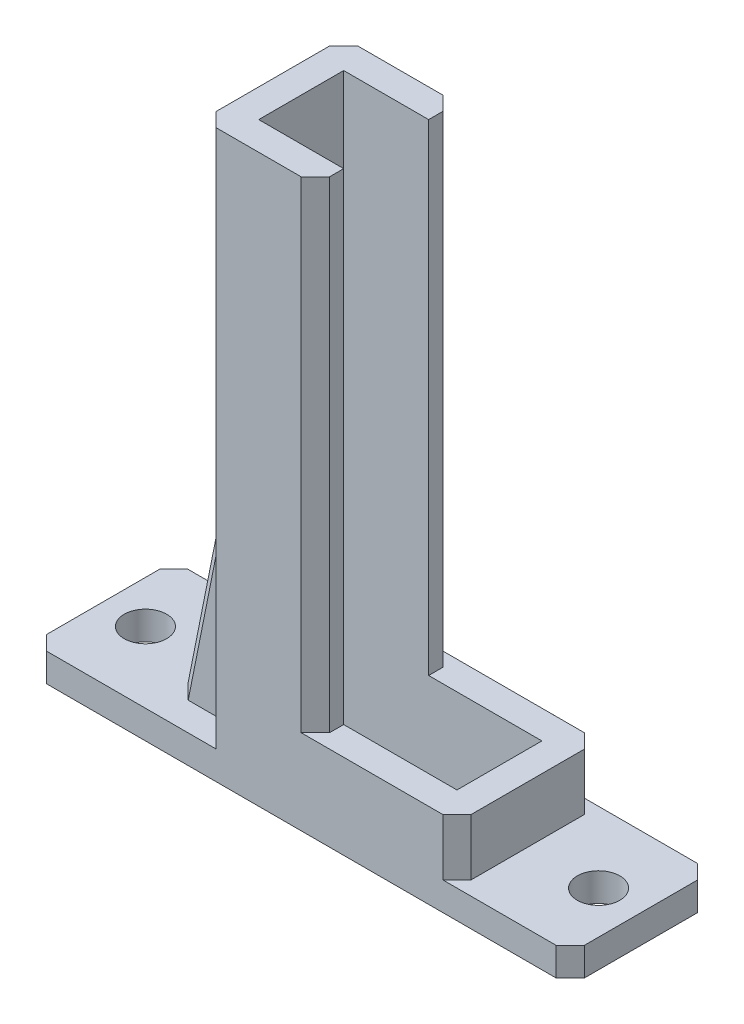
ISO-10303-21;
HEADER;
FILE_DESCRIPTION(('STEP AP214'),'2;1');
FILE_NAME('part.step','',(''),(''),'','','');
FILE_SCHEMA(('AUTOMOTIVE_DESIGN { 1 0 10303 214 1 1 1 1 }'));
ENDSEC;
DATA;
#1=APPLICATION_CONTEXT('core data for automotive mechanical design processes');
#2=APPLICATION_PROTOCOL_DEFINITION('international standard','automotive_design',2000,#1);
#3=PRODUCT_CONTEXT('',#1,'mechanical');
#4=PRODUCT('Part','Part','',(#3));
#5=PRODUCT_RELATED_PRODUCT_CATEGORY('part','',(#4));
#6=PRODUCT_DEFINITION_FORMATION('','',#4);
#7=PRODUCT_DEFINITION_CONTEXT('part definition',#1,'design');
#8=PRODUCT_DEFINITION('design','',#6,#7);
#9=PRODUCT_DEFINITION_SHAPE('','',#8);
#10=(LENGTH_UNIT() NAMED_UNIT(*) SI_UNIT(.MILLI.,.METRE.));
#11=(NAMED_UNIT(*) PLANE_ANGLE_UNIT() SI_UNIT($,.RADIAN.));
#12=(NAMED_UNIT(*) SI_UNIT($,.STERADIAN.) SOLID_ANGLE_UNIT());
#13=UNCERTAINTY_MEASURE_WITH_UNIT(LENGTH_MEASURE(1.E-05),#10,'distance_accuracy_value','');
#14=(GEOMETRIC_REPRESENTATION_CONTEXT(3) GLOBAL_UNCERTAINTY_ASSIGNED_CONTEXT((#13)) GLOBAL_UNIT_ASSIGNED_CONTEXT((#10,
#11,#12)) REPRESENTATION_CONTEXT('',''));
#15=CARTESIAN_POINT('',(0.,0.,0.));
#16=DIRECTION('',(0.,0.,1.));
#17=DIRECTION('',(1.,0.,0.));
#18=AXIS2_PLACEMENT_3D('',#15,#16,#17);
#19=CARTESIAN_POINT('',(0.,6.,0.));
#20=DIRECTION('',(1.,0.,0.));
#21=DIRECTION('',(0.,0.,-1.));
#22=AXIS2_PLACEMENT_3D('',#19,#20,#21);
#23=PLANE('',#22);
#24=DIRECTION('',(0.,0.,1.));
#25=VECTOR('',#24,1.);
#26=CARTESIAN_POINT('',(0.,40.,-10.));
#27=LINE('',#26,#25);
#28=CARTESIAN_POINT('',(0.,40.,-8.99999999999999));
#29=VERTEX_POINT('',#28);
#30=CARTESIAN_POINT('',(0.,40.,-1.00000000000001));
#31=VERTEX_POINT('',#30);
#32=EDGE_CURVE('E586',#29,#31,#27,.T.);
#33=ORIENTED_EDGE('',*,*,#32,.F.);
#34=DIRECTION('',(0.,-1.,0.));
#35=VECTOR('',#34,1.);
#36=CARTESIAN_POINT('',(0.,6.,-8.99999999999999));
#37=LINE('',#36,#35);
#38=CARTESIAN_POINT('',(0.,2.,-8.99999999999999));
#39=VERTEX_POINT('',#38);
#40=EDGE_CURVE('E469',#29,#39,#37,.T.);
#41=ORIENTED_EDGE('',*,*,#40,.T.);
#42=DIRECTION('',(0.,0.,-1.));
#43=VECTOR('',#42,1.);
#44=CARTESIAN_POINT('',(0.,2.,0.));
#45=LINE('',#44,#43);
#46=CARTESIAN_POINT('',(0.,2.,-8.));
#47=VERTEX_POINT('',#46);
#48=EDGE_CURVE('E557',#47,#39,#45,.T.);
#49=ORIENTED_EDGE('',*,*,#48,.F.);
#50=DIRECTION('',(0.,1.,0.));
#51=VECTOR('',#50,1.);
#52=CARTESIAN_POINT('',(0.,22.,-8.));
#53=LINE('',#52,#51);
#54=CARTESIAN_POINT('',(0.,16.9009804864072,-8.));
#55=VERTEX_POINT('',#54);
#56=EDGE_CURVE('E639',#47,#55,#53,.T.);
#57=ORIENTED_EDGE('',*,*,#56,.T.);
#58=DIRECTION('',(0.,-0.981306762925316,-0.192450089729874));
#59=VECTOR('',#58,1.);
#60=CARTESIAN_POINT('',(0.,7.91456061463515,-9.76238193398089));
#61=LINE('',#60,#59);
#62=CARTESIAN_POINT('',(0.,22.,-7.));
#63=VERTEX_POINT('',#62);
#64=EDGE_CURVE('E11',#55,#63,#61,.F.);
#65=ORIENTED_EDGE('',*,*,#64,.T.);
#66=DIRECTION('',(0.,0.,1.));
#67=VECTOR('',#66,1.);
#68=CARTESIAN_POINT('',(0.,22.,-8.));
#69=LINE('',#68,#67);
#70=CARTESIAN_POINT('',(0.,22.,-3.));
#71=VERTEX_POINT('',#70);
#72=EDGE_CURVE('E521',#63,#71,#69,.T.);
#73=ORIENTED_EDGE('',*,*,#72,.T.);
#74=DIRECTION('',(0.,-0.981306762925316,0.192450089729876));
#75=VECTOR('',#74,1.);
#76=CARTESIAN_POINT('',(0.,6.02603486886006,0.132752304351294));
#77=LINE('',#76,#75);
#78=CARTESIAN_POINT('',(0.,16.9009804864072,-2.));
#79=VERTEX_POINT('',#78);
#80=EDGE_CURVE('E508',#71,#79,#77,.T.);
#81=ORIENTED_EDGE('',*,*,#80,.T.);
#82=DIRECTION('',(0.,1.,0.));
#83=VECTOR('',#82,1.);
#84=CARTESIAN_POINT('',(0.,22.,-2.));
#85=LINE('',#84,#83);
#86=CARTESIAN_POINT('',(0.,2.,-2.));
#87=VERTEX_POINT('',#86);
#88=EDGE_CURVE('E518',#87,#79,#85,.T.);
#89=ORIENTED_EDGE('',*,*,#88,.F.);
#90=CARTESIAN_POINT('',(0.,2.,-1.00000000000001));
#91=VERTEX_POINT('',#90);
#92=EDGE_CURVE('E554',#91,#87,#45,.T.);
#93=ORIENTED_EDGE('',*,*,#92,.F.);
#94=DIRECTION('',(0.,1.,0.));
#95=VECTOR('',#94,1.);
#96=CARTESIAN_POINT('',(0.,6.,-1.00000000000001));
#97=LINE('',#96,#95);
#98=EDGE_CURVE('E465',#91,#31,#97,.T.);
#99=ORIENTED_EDGE('',*,*,#98,.T.);
#100=EDGE_LOOP('',(#33,#41,#49,#57,#65,#73,#81,#89,#93,#99));
#101=FACE_BOUND('',#100,.T.);
#102=ADVANCED_FACE('F50',(#101),#23,.F.);
#103=CARTESIAN_POINT('',(18.,6.,0.));
#104=DIRECTION('',(-1.,0.,0.));
#105=DIRECTION('',(0.,0.,1.));
#106=AXIS2_PLACEMENT_3D('',#103,#104,#105);
#107=PLANE('',#106);
#108=DIRECTION('',(0.,0.,1.));
#109=VECTOR('',#108,1.);
#110=CARTESIAN_POINT('',(18.,2.,0.));
#111=LINE('',#110,#109);
#112=CARTESIAN_POINT('',(18.,2.,-8.99999999999999));
#113=VERTEX_POINT('',#112);
#114=CARTESIAN_POINT('',(18.,2.,-1.00000000000001));
#115=VERTEX_POINT('',#114);
#116=EDGE_CURVE('E574',#113,#115,#111,.T.);
#117=ORIENTED_EDGE('',*,*,#116,.F.);
#118=DIRECTION('',(0.,1.,0.));
#119=VECTOR('',#118,1.);
#120=CARTESIAN_POINT('',(18.,6.,-8.99999999999999));
#121=LINE('',#120,#119);
#122=CARTESIAN_POINT('',(18.,6.,-8.99999999999999));
#123=VERTEX_POINT('',#122);
#124=EDGE_CURVE('E438',#113,#123,#121,.T.);
#125=ORIENTED_EDGE('',*,*,#124,.T.);
#126=DIRECTION('',(0.,0.,-1.));
#127=VECTOR('',#126,1.);
#128=CARTESIAN_POINT('',(18.,6.,0.));
#129=LINE('',#128,#127);
#130=CARTESIAN_POINT('',(18.,6.,-1.00000000000001));
#131=VERTEX_POINT('',#130);
#132=EDGE_CURVE('E346',#131,#123,#129,.T.);
#133=ORIENTED_EDGE('',*,*,#132,.F.);
#134=DIRECTION('',(0.,-1.,0.));
#135=VECTOR('',#134,1.);
#136=CARTESIAN_POINT('',(18.,6.,-1.00000000000001));
#137=LINE('',#136,#135);
#138=EDGE_CURVE('E434',#131,#115,#137,.T.);
#139=ORIENTED_EDGE('',*,*,#138,.T.);
#140=EDGE_LOOP('',(#117,#125,#133,#139));
#141=FACE_BOUND('',#140,.T.);
#142=ADVANCED_FACE('F685',(#141),#107,.F.);
#143=CARTESIAN_POINT('',(0.,6.,0.));
#144=DIRECTION('',(0.,-1.,0.));
#145=DIRECTION('',(0.,0.,-1.));
#146=AXIS2_PLACEMENT_3D('',#143,#144,#145);
#147=PLANE('',#146);
#148=ORIENTED_EDGE('',*,*,#132,.T.);
#149=DIRECTION('',(0.707106781186545,0.,0.70710678118655));
#150=VECTOR('',#149,1.);
#151=CARTESIAN_POINT('',(17.,6.,-10.));
#152=LINE('',#151,#150);
#153=CARTESIAN_POINT('',(17.,6.,-10.));
#154=VERTEX_POINT('',#153);
#155=EDGE_CURVE('E443',#123,#154,#152,.F.);
#156=ORIENTED_EDGE('',*,*,#155,.T.);
#157=DIRECTION('',(-1.,0.,0.));
#158=VECTOR('',#157,1.);
#159=CARTESIAN_POINT('',(0.,6.,-10.));
#160=LINE('',#159,#158);
#161=CARTESIAN_POINT('',(6.99999999999999,6.,-10.));
#162=VERTEX_POINT('',#161);
#163=EDGE_CURVE('E354',#154,#162,#160,.T.);
#164=ORIENTED_EDGE('',*,*,#163,.T.);
#165=DIRECTION('',(-0.707106781186548,0.,-0.707106781186548));
#166=VECTOR('',#165,1.);
#167=CARTESIAN_POINT('',(8.49999999999999,6.,-8.49999999999999));
#168=LINE('',#167,#166);
#169=CARTESIAN_POINT('',(8.,6.,-8.99999999999999));
#170=VERTEX_POINT('',#169);
#171=EDGE_CURVE('E479',#162,#170,#168,.F.);
#172=ORIENTED_EDGE('',*,*,#171,.T.);
#173=DIRECTION('',(0.,0.,-1.));
#174=VECTOR('',#173,1.);
#175=CARTESIAN_POINT('',(8.,6.,-8.));
#176=LINE('',#175,#174);
#177=CARTESIAN_POINT('',(8.,6.,-8.));
#178=VERTEX_POINT('',#177);
#179=EDGE_CURVE('E297',#178,#170,#176,.T.);
#180=ORIENTED_EDGE('',*,*,#179,.F.);
#181=DIRECTION('',(-1.,0.,0.));
#182=VECTOR('',#181,1.);
#183=CARTESIAN_POINT('',(2.,6.,-8.));
#184=LINE('',#183,#182);
#185=CARTESIAN_POINT('',(16.,6.,-8.));
#186=VERTEX_POINT('',#185);
#187=EDGE_CURVE('E311',#186,#178,#184,.T.);
#188=ORIENTED_EDGE('',*,*,#187,.F.);
#189=DIRECTION('',(0.,0.,-1.));
#190=VECTOR('',#189,1.);
#191=CARTESIAN_POINT('',(16.,6.,-2.));
#192=LINE('',#191,#190);
#193=CARTESIAN_POINT('',(16.,6.,-2.));
#194=VERTEX_POINT('',#193);
#195=EDGE_CURVE('E310',#194,#186,#192,.T.);
#196=ORIENTED_EDGE('',*,*,#195,.F.);
#197=DIRECTION('',(1.,0.,0.));
#198=VECTOR('',#197,1.);
#199=CARTESIAN_POINT('',(2.,6.,-2.));
#200=LINE('',#199,#198);
#201=CARTESIAN_POINT('',(8.,6.,-2.));
#202=VERTEX_POINT('',#201);
#203=EDGE_CURVE('E308',#202,#194,#200,.T.);
#204=ORIENTED_EDGE('',*,*,#203,.F.);
#205=DIRECTION('',(0.,0.,-1.));
#206=VECTOR('',#205,1.);
#207=CARTESIAN_POINT('',(8.,6.,0.));
#208=LINE('',#207,#206);
#209=CARTESIAN_POINT('',(8.,6.,-1.00000000000001));
#210=VERTEX_POINT('',#209);
#211=EDGE_CURVE('E275',#210,#202,#208,.T.);
#212=ORIENTED_EDGE('',*,*,#211,.F.);
#213=DIRECTION('',(0.707106781186548,0.,-0.707106781186548));
#214=VECTOR('',#213,1.);
#215=CARTESIAN_POINT('',(3.5,6.,3.5));
#216=LINE('',#215,#214);
#217=CARTESIAN_POINT('',(6.99999999999999,6.,0.));
#218=VERTEX_POINT('',#217);
#219=EDGE_CURVE('E485',#210,#218,#216,.F.);
#220=ORIENTED_EDGE('',*,*,#219,.T.);
#221=DIRECTION('',(1.,0.,0.));
#222=VECTOR('',#221,1.);
#223=CARTESIAN_POINT('',(0.,6.,0.));
#224=LINE('',#223,#222);
#225=CARTESIAN_POINT('',(17.,6.,0.));
#226=VERTEX_POINT('',#225);
#227=EDGE_CURVE('E343',#218,#226,#224,.T.);
#228=ORIENTED_EDGE('',*,*,#227,.T.);
#229=DIRECTION('',(-0.707106781186548,0.,0.707106781186548));
#230=VECTOR('',#229,1.);
#231=CARTESIAN_POINT('',(18.,6.,-1.00000000000001));
#232=LINE('',#231,#230);
#233=EDGE_CURVE('E445',#226,#131,#232,.F.);
#234=ORIENTED_EDGE('',*,*,#233,.T.);
#235=EDGE_LOOP('',(#148,#156,#164,#172,#180,#188,#196,#204,#212,#220,#228,#234));
#236=FACE_BOUND('',#235,.T.);
#237=ADVANCED_FACE('F599',(#236),#147,.F.);
#238=CARTESIAN_POINT('',(0.,0.,0.));
#239=DIRECTION('',(0.,-1.,0.));
#240=DIRECTION('',(0.,0.,-1.));
#241=AXIS2_PLACEMENT_3D('',#238,#239,#240);
#242=PLANE('',#241);
#243=CARTESIAN_POINT('',(-9.,0.,-5.));
#244=DIRECTION('',(0.,1.,0.));
#245=DIRECTION('',(0.,0.,1.));
#246=AXIS2_PLACEMENT_3D('',#243,#244,#245);
#247=CIRCLE('',#246,1.5);
#248=CARTESIAN_POINT('',(-9.,0.,-3.5));
#249=VERTEX_POINT('',#248);
#250=EDGE_CURVE('E533',#249,#249,#247,.T.);
#251=ORIENTED_EDGE('',*,*,#250,.T.);
#252=EDGE_LOOP('',(#251));
#253=FACE_BOUND('',#252,.T.);
#254=CARTESIAN_POINT('',(23.,0.,-5.));
#255=DIRECTION('',(0.,1.,0.));
#256=DIRECTION('',(0.,0.,1.));
#257=AXIS2_PLACEMENT_3D('',#254,#255,#256);
#258=CIRCLE('',#257,1.5);
#259=CARTESIAN_POINT('',(23.,0.,-3.5));
#260=VERTEX_POINT('',#259);
#261=EDGE_CURVE('E646',#260,#260,#258,.T.);
#262=ORIENTED_EDGE('',*,*,#261,.T.);
#263=EDGE_LOOP('',(#262));
#264=FACE_BOUND('',#263,.T.);
#265=DIRECTION('',(1.,0.,0.));
#266=VECTOR('',#265,1.);
#267=CARTESIAN_POINT('',(0.,0.,0.));
#268=LINE('',#267,#266);
#269=CARTESIAN_POINT('',(-11.,0.,0.));
#270=VERTEX_POINT('',#269);
#271=CARTESIAN_POINT('',(25.,0.,0.));
#272=VERTEX_POINT('',#271);
#273=EDGE_CURVE('E344',#270,#272,#268,.T.);
#274=ORIENTED_EDGE('',*,*,#273,.F.);
#275=DIRECTION('',(0.707106781186545,0.,0.70710678118655));
#276=VECTOR('',#275,1.);
#277=CARTESIAN_POINT('',(-5.50000000000004,0.,5.5));
#278=LINE('',#277,#276);
#279=CARTESIAN_POINT('',(-12.,0.,-1.00000000000001));
#280=VERTEX_POINT('',#279);
#281=EDGE_CURVE('E389',#270,#280,#278,.F.);
#282=ORIENTED_EDGE('',*,*,#281,.T.);
#283=DIRECTION('',(0.,0.,1.));
#284=VECTOR('',#283,1.);
#285=CARTESIAN_POINT('',(-12.,0.,0.));
#286=LINE('',#285,#284);
#287=CARTESIAN_POINT('',(-12.,0.,-8.99999999999999));
#288=VERTEX_POINT('',#287);
#289=EDGE_CURVE('E567',#288,#280,#286,.T.);
#290=ORIENTED_EDGE('',*,*,#289,.F.);
#291=DIRECTION('',(-0.707106781186548,0.,0.707106781186548));
#292=VECTOR('',#291,1.);
#293=CARTESIAN_POINT('',(-10.5,0.,-10.5));
#294=LINE('',#293,#292);
#295=CARTESIAN_POINT('',(-11.,0.,-10.));
#296=VERTEX_POINT('',#295);
#297=EDGE_CURVE('E384',#288,#296,#294,.F.);
#298=ORIENTED_EDGE('',*,*,#297,.T.);
#299=DIRECTION('',(-1.,0.,0.));
#300=VECTOR('',#299,1.);
#301=CARTESIAN_POINT('',(0.,0.,-10.));
#302=LINE('',#301,#300);
#303=CARTESIAN_POINT('',(25.,0.,-10.));
#304=VERTEX_POINT('',#303);
#305=EDGE_CURVE('E349',#304,#296,#302,.T.);
#306=ORIENTED_EDGE('',*,*,#305,.F.);
#307=DIRECTION('',(-0.707106781186545,0.,-0.70710678118655));
#308=VECTOR('',#307,1.);
#309=CARTESIAN_POINT('',(17.5000000000001,0.,-17.5));
#310=LINE('',#309,#308);
#311=CARTESIAN_POINT('',(26.,0.,-8.99999999999999));
#312=VERTEX_POINT('',#311);
#313=EDGE_CURVE('E385',#304,#312,#310,.F.);
#314=ORIENTED_EDGE('',*,*,#313,.T.);
#315=DIRECTION('',(0.,0.,-1.));
#316=VECTOR('',#315,1.);
#317=CARTESIAN_POINT('',(26.,0.,0.));
#318=LINE('',#317,#316);
#319=CARTESIAN_POINT('',(26.,0.,-1.00000000000001));
#320=VERTEX_POINT('',#319);
#321=EDGE_CURVE('E568',#320,#312,#318,.T.);
#322=ORIENTED_EDGE('',*,*,#321,.F.);
#323=DIRECTION('',(0.707106781186548,0.,-0.707106781186548));
#324=VECTOR('',#323,1.);
#325=CARTESIAN_POINT('',(12.5,0.,12.5));
#326=LINE('',#325,#324);
#327=EDGE_CURVE('E377',#320,#272,#326,.F.);
#328=ORIENTED_EDGE('',*,*,#327,.T.);
#329=EDGE_LOOP('',(#274,#282,#290,#298,#306,#314,#322,#328));
#330=FACE_BOUND('',#329,.T.);
#331=DIRECTION('',(0.,0.,1.));
#332=VECTOR('',#331,1.);
#333=CARTESIAN_POINT('',(2.,0.,-2.));
#334=LINE('',#333,#332);
#335=CARTESIAN_POINT('',(2.,0.,-8.));
#336=VERTEX_POINT('',#335);
#337=CARTESIAN_POINT('',(2.,0.,-2.));
#338=VERTEX_POINT('',#337);
#339=EDGE_CURVE('E309',#336,#338,#334,.T.);
#340=ORIENTED_EDGE('',*,*,#339,.T.);
#341=DIRECTION('',(1.,0.,0.));
#342=VECTOR('',#341,1.);
#343=CARTESIAN_POINT('',(2.,0.,-2.));
#344=LINE('',#343,#342);
#345=CARTESIAN_POINT('',(16.,0.,-2.));
#346=VERTEX_POINT('',#345);
#347=EDGE_CURVE('E277',#338,#346,#344,.T.);
#348=ORIENTED_EDGE('',*,*,#347,.T.);
#349=DIRECTION('',(0.,0.,-1.));
#350=VECTOR('',#349,1.);
#351=CARTESIAN_POINT('',(16.,0.,-2.));
#352=LINE('',#351,#350);
#353=CARTESIAN_POINT('',(16.,0.,-8.));
#354=VERTEX_POINT('',#353);
#355=EDGE_CURVE('E319',#346,#354,#352,.T.);
#356=ORIENTED_EDGE('',*,*,#355,.T.);
#357=DIRECTION('',(-1.,0.,0.));
#358=VECTOR('',#357,1.);
#359=CARTESIAN_POINT('',(2.,0.,-8.));
#360=LINE('',#359,#358);
#361=EDGE_CURVE('E322',#354,#336,#360,.T.);
#362=ORIENTED_EDGE('',*,*,#361,.T.);
#363=EDGE_LOOP('',(#340,#348,#356,#362));
#364=FACE_BOUND('',#363,.T.);
#365=ADVANCED_FACE('F606',(#253,#264,#330,#364),#242,.T.);
#366=CARTESIAN_POINT('',(0.,6.,0.));
#367=DIRECTION('',(0.,0.,-1.));
#368=DIRECTION('',(-1.,0.,0.));
#369=AXIS2_PLACEMENT_3D('',#366,#367,#368);
#370=PLANE('',#369);
#371=DIRECTION('',(1.,0.,0.));
#372=VECTOR('',#371,1.);
#373=CARTESIAN_POINT('',(0.,2.,0.));
#374=LINE('',#373,#372);
#375=CARTESIAN_POINT('',(-11.,2.,0.));
#376=VERTEX_POINT('',#375);
#377=CARTESIAN_POINT('',(1.00000000000001,2.,0.));
#378=VERTEX_POINT('',#377);
#379=EDGE_CURVE('E299',#376,#378,#374,.T.);
#380=ORIENTED_EDGE('',*,*,#379,.F.);
#381=DIRECTION('',(0.,-1.,0.));
#382=VECTOR('',#381,1.);
#383=CARTESIAN_POINT('',(-11.,6.,0.));
#384=LINE('',#383,#382);
#385=EDGE_CURVE('E374',#376,#270,#384,.T.);
#386=ORIENTED_EDGE('',*,*,#385,.T.);
#387=ORIENTED_EDGE('',*,*,#273,.T.);
#388=DIRECTION('',(0.,1.,0.));
#389=VECTOR('',#388,1.);
#390=CARTESIAN_POINT('',(25.,6.,0.));
#391=LINE('',#390,#389);
#392=CARTESIAN_POINT('',(25.,2.,0.));
#393=VERTEX_POINT('',#392);
#394=EDGE_CURVE('E375',#272,#393,#391,.T.);
#395=ORIENTED_EDGE('',*,*,#394,.T.);
#396=DIRECTION('',(1.,0.,0.));
#397=VECTOR('',#396,1.);
#398=CARTESIAN_POINT('',(18.,2.,0.));
#399=LINE('',#398,#397);
#400=CARTESIAN_POINT('',(17.,2.,0.));
#401=VERTEX_POINT('',#400);
#402=EDGE_CURVE('E579',#401,#393,#399,.T.);
#403=ORIENTED_EDGE('',*,*,#402,.F.);
#404=DIRECTION('',(0.,1.,0.));
#405=VECTOR('',#404,1.);
#406=CARTESIAN_POINT('',(17.,6.,0.));
#407=LINE('',#406,#405);
#408=EDGE_CURVE('E369',#401,#226,#407,.T.);
#409=ORIENTED_EDGE('',*,*,#408,.T.);
#410=ORIENTED_EDGE('',*,*,#227,.F.);
#411=DIRECTION('',(0.,1.,0.));
#412=VECTOR('',#411,1.);
#413=CARTESIAN_POINT('',(6.99999999999999,6.,0.));
#414=LINE('',#413,#412);
#415=CARTESIAN_POINT('',(6.99999999999999,40.,0.));
#416=VERTEX_POINT('',#415);
#417=EDGE_CURVE('E368',#218,#416,#414,.T.);
#418=ORIENTED_EDGE('',*,*,#417,.T.);
#419=DIRECTION('',(1.,0.,0.));
#420=VECTOR('',#419,1.);
#421=CARTESIAN_POINT('',(0.,40.,0.));
#422=LINE('',#421,#420);
#423=CARTESIAN_POINT('',(1.00000000000001,40.,0.));
#424=VERTEX_POINT('',#423);
#425=EDGE_CURVE('E266',#424,#416,#422,.T.);
#426=ORIENTED_EDGE('',*,*,#425,.F.);
#427=DIRECTION('',(0.,-1.,0.));
#428=VECTOR('',#427,1.);
#429=CARTESIAN_POINT('',(1.00000000000001,6.,0.));
#430=LINE('',#429,#428);
#431=EDGE_CURVE('E356',#424,#378,#430,.T.);
#432=ORIENTED_EDGE('',*,*,#431,.T.);
#433=EDGE_LOOP('',(#380,#386,#387,#395,#403,#409,#410,#418,#426,#432));
#434=FACE_BOUND('',#433,.T.);
#435=ADVANCED_FACE('F694',(#434),#370,.F.);
#436=CARTESIAN_POINT('',(0.,6.,-10.));
#437=DIRECTION('',(0.,0.,1.));
#438=DIRECTION('',(1.,0.,0.));
#439=AXIS2_PLACEMENT_3D('',#436,#437,#438);
#440=PLANE('',#439);
#441=ORIENTED_EDGE('',*,*,#305,.T.);
#442=DIRECTION('',(0.,1.,0.));
#443=VECTOR('',#442,1.);
#444=CARTESIAN_POINT('',(-11.,6.,-10.));
#445=LINE('',#444,#443);
#446=CARTESIAN_POINT('',(-11.,2.,-10.));
#447=VERTEX_POINT('',#446);
#448=EDGE_CURVE('E420',#296,#447,#445,.T.);
#449=ORIENTED_EDGE('',*,*,#448,.T.);
#450=DIRECTION('',(-1.,0.,0.));
#451=VECTOR('',#450,1.);
#452=CARTESIAN_POINT('',(0.,2.,-10.));
#453=LINE('',#452,#451);
#454=CARTESIAN_POINT('',(1.00000000000001,2.,-10.));
#455=VERTEX_POINT('',#454);
#456=EDGE_CURVE('E556',#455,#447,#453,.T.);
#457=ORIENTED_EDGE('',*,*,#456,.F.);
#458=DIRECTION('',(0.,1.,0.));
#459=VECTOR('',#458,1.);
#460=CARTESIAN_POINT('',(1.00000000000001,6.,-10.));
#461=LINE('',#460,#459);
#462=CARTESIAN_POINT('',(1.00000000000001,40.,-10.));
#463=VERTEX_POINT('',#462);
#464=EDGE_CURVE('E404',#455,#463,#461,.T.);
#465=ORIENTED_EDGE('',*,*,#464,.T.);
#466=DIRECTION('',(-1.,0.,0.));
#467=VECTOR('',#466,1.);
#468=CARTESIAN_POINT('',(8.,40.,-10.));
#469=LINE('',#468,#467);
#470=CARTESIAN_POINT('',(6.99999999999999,40.,-10.));
#471=VERTEX_POINT('',#470);
#472=EDGE_CURVE('E302',#471,#463,#469,.T.);
#473=ORIENTED_EDGE('',*,*,#472,.F.);
#474=DIRECTION('',(0.,-1.,0.));
#475=VECTOR('',#474,1.);
#476=CARTESIAN_POINT('',(6.99999999999999,6.,-10.));
#477=LINE('',#476,#475);
#478=EDGE_CURVE('E407',#471,#162,#477,.T.);
#479=ORIENTED_EDGE('',*,*,#478,.T.);
#480=ORIENTED_EDGE('',*,*,#163,.F.);
#481=DIRECTION('',(0.,-1.,0.));
#482=VECTOR('',#481,1.);
#483=CARTESIAN_POINT('',(17.,6.,-10.));
#484=LINE('',#483,#482);
#485=CARTESIAN_POINT('',(17.,2.,-10.));
#486=VERTEX_POINT('',#485);
#487=EDGE_CURVE('E411',#154,#486,#484,.T.);
#488=ORIENTED_EDGE('',*,*,#487,.T.);
#489=DIRECTION('',(-1.,0.,0.));
#490=VECTOR('',#489,1.);
#491=CARTESIAN_POINT('',(18.,2.,-10.));
#492=LINE('',#491,#490);
#493=CARTESIAN_POINT('',(25.,2.,-10.));
#494=VERTEX_POINT('',#493);
#495=EDGE_CURVE('E545',#494,#486,#492,.T.);
#496=ORIENTED_EDGE('',*,*,#495,.F.);
#497=DIRECTION('',(0.,-1.,0.));
#498=VECTOR('',#497,1.);
#499=CARTESIAN_POINT('',(25.,6.,-10.));
#500=LINE('',#499,#498);
#501=EDGE_CURVE('E415',#494,#304,#500,.T.);
#502=ORIENTED_EDGE('',*,*,#501,.T.);
#503=EDGE_LOOP('',(#441,#449,#457,#465,#473,#479,#480,#488,#496,#502));
#504=FACE_BOUND('',#503,.T.);
#505=ADVANCED_FACE('F628',(#504),#440,.F.);
#506=CARTESIAN_POINT('',(2.,6.,-2.));
#507=DIRECTION('',(0.,0.,-1.));
#508=DIRECTION('',(-1.,0.,0.));
#509=AXIS2_PLACEMENT_3D('',#506,#507,#508);
#510=PLANE('',#509);
#511=ORIENTED_EDGE('',*,*,#347,.F.);
#512=DIRECTION('',(0.,-1.,0.));
#513=VECTOR('',#512,1.);
#514=CARTESIAN_POINT('',(2.,6.,-2.));
#515=LINE('',#514,#513);
#516=CARTESIAN_POINT('',(2.,40.,-2.));
#517=VERTEX_POINT('',#516);
#518=EDGE_CURVE('E281',#517,#338,#515,.T.);
#519=ORIENTED_EDGE('',*,*,#518,.F.);
#520=DIRECTION('',(-1.,0.,0.));
#521=VECTOR('',#520,1.);
#522=CARTESIAN_POINT('',(8.,40.,-2.));
#523=LINE('',#522,#521);
#524=CARTESIAN_POINT('',(8.,40.,-2.));
#525=VERTEX_POINT('',#524);
#526=EDGE_CURVE('E260',#525,#517,#523,.T.);
#527=ORIENTED_EDGE('',*,*,#526,.F.);
#528=DIRECTION('',(0.,-1.,0.));
#529=VECTOR('',#528,1.);
#530=CARTESIAN_POINT('',(8.,40.,-2.));
#531=LINE('',#530,#529);
#532=EDGE_CURVE('E267',#525,#202,#531,.T.);
#533=ORIENTED_EDGE('',*,*,#532,.T.);
#534=ORIENTED_EDGE('',*,*,#203,.T.);
#535=DIRECTION('',(0.,-1.,0.));
#536=VECTOR('',#535,1.);
#537=CARTESIAN_POINT('',(16.,6.,-2.));
#538=LINE('',#537,#536);
#539=EDGE_CURVE('E338',#194,#346,#538,.T.);
#540=ORIENTED_EDGE('',*,*,#539,.T.);
#541=EDGE_LOOP('',(#511,#519,#527,#533,#534,#540));
#542=FACE_BOUND('',#541,.T.);
#543=ADVANCED_FACE('F276',(#542),#510,.T.);
#544=CARTESIAN_POINT('',(16.,6.,-2.));
#545=DIRECTION('',(-1.,0.,0.));
#546=DIRECTION('',(0.,0.,1.));
#547=AXIS2_PLACEMENT_3D('',#544,#545,#546);
#548=PLANE('',#547);
#549=ORIENTED_EDGE('',*,*,#355,.F.);
#550=ORIENTED_EDGE('',*,*,#539,.F.);
#551=ORIENTED_EDGE('',*,*,#195,.T.);
#552=DIRECTION('',(0.,-1.,0.));
#553=VECTOR('',#552,1.);
#554=CARTESIAN_POINT('',(16.,6.,-8.));
#555=LINE('',#554,#553);
#556=EDGE_CURVE('E336',#186,#354,#555,.T.);
#557=ORIENTED_EDGE('',*,*,#556,.T.);
#558=EDGE_LOOP('',(#549,#550,#551,#557));
#559=FACE_BOUND('',#558,.T.);
#560=ADVANCED_FACE('F604',(#559),#548,.T.);
#561=CARTESIAN_POINT('',(2.,6.,-8.));
#562=DIRECTION('',(0.,0.,1.));
#563=DIRECTION('',(1.,0.,0.));
#564=AXIS2_PLACEMENT_3D('',#561,#562,#563);
#565=PLANE('',#564);
#566=ORIENTED_EDGE('',*,*,#361,.F.);
#567=ORIENTED_EDGE('',*,*,#556,.F.);
#568=ORIENTED_EDGE('',*,*,#187,.T.);
#569=DIRECTION('',(0.,-1.,0.));
#570=VECTOR('',#569,1.);
#571=CARTESIAN_POINT('',(8.,40.,-8.));
#572=LINE('',#571,#570);
#573=CARTESIAN_POINT('',(8.,40.,-8.));
#574=VERTEX_POINT('',#573);
#575=EDGE_CURVE('E280',#574,#178,#572,.T.);
#576=ORIENTED_EDGE('',*,*,#575,.F.);
#577=DIRECTION('',(1.,0.,0.));
#578=VECTOR('',#577,1.);
#579=CARTESIAN_POINT('',(2.,40.,-8.));
#580=LINE('',#579,#578);
#581=CARTESIAN_POINT('',(2.,40.,-8.));
#582=VERTEX_POINT('',#581);
#583=EDGE_CURVE('E286',#582,#574,#580,.T.);
#584=ORIENTED_EDGE('',*,*,#583,.F.);
#585=DIRECTION('',(0.,-1.,0.));
#586=VECTOR('',#585,1.);
#587=CARTESIAN_POINT('',(2.,6.,-8.));
#588=LINE('',#587,#586);
#589=EDGE_CURVE('E334',#582,#336,#588,.T.);
#590=ORIENTED_EDGE('',*,*,#589,.T.);
#591=EDGE_LOOP('',(#566,#567,#568,#576,#584,#590));
#592=FACE_BOUND('',#591,.T.);
#593=ADVANCED_FACE('F616',(#592),#565,.T.);
#594=CARTESIAN_POINT('',(2.,6.,-2.));
#595=DIRECTION('',(1.,0.,0.));
#596=DIRECTION('',(0.,0.,-1.));
#597=AXIS2_PLACEMENT_3D('',#594,#595,#596);
#598=PLANE('',#597);
#599=ORIENTED_EDGE('',*,*,#339,.F.);
#600=ORIENTED_EDGE('',*,*,#589,.F.);
#601=DIRECTION('',(0.,0.,-1.));
#602=VECTOR('',#601,1.);
#603=CARTESIAN_POINT('',(2.,40.,-2.));
#604=LINE('',#603,#602);
#605=EDGE_CURVE('E284',#517,#582,#604,.T.);
#606=ORIENTED_EDGE('',*,*,#605,.F.);
#607=ORIENTED_EDGE('',*,*,#518,.T.);
#608=EDGE_LOOP('',(#599,#600,#606,#607));
#609=FACE_BOUND('',#608,.T.);
#610=ADVANCED_FACE('F612',(#609),#598,.T.);
#611=CARTESIAN_POINT('',(8.,40.,0.));
#612=DIRECTION('',(-1.,0.,0.));
#613=DIRECTION('',(0.,0.,1.));
#614=AXIS2_PLACEMENT_3D('',#611,#612,#613);
#615=PLANE('',#614);
#616=DIRECTION('',(0.,0.,-1.));
#617=VECTOR('',#616,1.);
#618=CARTESIAN_POINT('',(8.,40.,0.));
#619=LINE('',#618,#617);
#620=CARTESIAN_POINT('',(8.,40.,-1.00000000000001));
#621=VERTEX_POINT('',#620);
#622=EDGE_CURVE('E253',#621,#525,#619,.T.);
#623=ORIENTED_EDGE('',*,*,#622,.F.);
#624=DIRECTION('',(0.,-1.,0.));
#625=VECTOR('',#624,1.);
#626=CARTESIAN_POINT('',(8.,40.,-1.00000000000001));
#627=LINE('',#626,#625);
#628=EDGE_CURVE('E462',#621,#210,#627,.T.);
#629=ORIENTED_EDGE('',*,*,#628,.T.);
#630=ORIENTED_EDGE('',*,*,#211,.T.);
#631=ORIENTED_EDGE('',*,*,#532,.F.);
#632=EDGE_LOOP('',(#623,#629,#630,#631));
#633=FACE_BOUND('',#632,.T.);
#634=ADVANCED_FACE('F269',(#633),#615,.F.);
#635=CARTESIAN_POINT('',(8.,40.,-8.));
#636=DIRECTION('',(-1.,0.,0.));
#637=DIRECTION('',(0.,0.,1.));
#638=AXIS2_PLACEMENT_3D('',#635,#636,#637);
#639=PLANE('',#638);
#640=ORIENTED_EDGE('',*,*,#179,.T.);
#641=DIRECTION('',(0.,1.,0.));
#642=VECTOR('',#641,1.);
#643=CARTESIAN_POINT('',(8.,40.,-8.99999999999999));
#644=LINE('',#643,#642);
#645=CARTESIAN_POINT('',(8.,40.,-8.99999999999999));
#646=VERTEX_POINT('',#645);
#647=EDGE_CURVE('E449',#170,#646,#644,.T.);
#648=ORIENTED_EDGE('',*,*,#647,.T.);
#649=DIRECTION('',(0.,0.,-1.));
#650=VECTOR('',#649,1.);
#651=CARTESIAN_POINT('',(8.,40.,-8.));
#652=LINE('',#651,#650);
#653=EDGE_CURVE('E295',#574,#646,#652,.T.);
#654=ORIENTED_EDGE('',*,*,#653,.F.);
#655=ORIENTED_EDGE('',*,*,#575,.T.);
#656=EDGE_LOOP('',(#640,#648,#654,#655));
#657=FACE_BOUND('',#656,.T.);
#658=ADVANCED_FACE('F618',(#657),#639,.F.);
#659=CARTESIAN_POINT('',(0.,40.,0.));
#660=DIRECTION('',(0.,1.,0.));
#661=DIRECTION('',(0.,0.,1.));
#662=AXIS2_PLACEMENT_3D('',#659,#660,#661);
#663=PLANE('',#662);
#664=ORIENTED_EDGE('',*,*,#653,.T.);
#665=DIRECTION('',(0.707106781186548,0.,0.707106781186548));
#666=VECTOR('',#665,1.);
#667=CARTESIAN_POINT('',(8.49999999999999,40.,-8.49999999999999));
#668=LINE('',#667,#666);
#669=EDGE_CURVE('E459',#646,#471,#668,.F.);
#670=ORIENTED_EDGE('',*,*,#669,.T.);
#671=ORIENTED_EDGE('',*,*,#472,.T.);
#672=DIRECTION('',(0.707106781186548,0.,-0.707106781186548));
#673=VECTOR('',#672,1.);
#674=CARTESIAN_POINT('',(-4.5,40.,-4.5));
#675=LINE('',#674,#673);
#676=EDGE_CURVE('E453',#463,#29,#675,.F.);
#677=ORIENTED_EDGE('',*,*,#676,.T.);
#678=ORIENTED_EDGE('',*,*,#32,.T.);
#679=DIRECTION('',(-0.707106781186548,0.,-0.707106781186548));
#680=VECTOR('',#679,1.);
#681=CARTESIAN_POINT('',(0.500000000000004,40.,-0.500000000000004));
#682=LINE('',#681,#680);
#683=EDGE_CURVE('E451',#31,#424,#682,.F.);
#684=ORIENTED_EDGE('',*,*,#683,.T.);
#685=ORIENTED_EDGE('',*,*,#425,.T.);
#686=DIRECTION('',(-0.707106781186548,0.,0.707106781186548));
#687=VECTOR('',#686,1.);
#688=CARTESIAN_POINT('',(3.5,40.,3.5));
#689=LINE('',#688,#687);
#690=EDGE_CURVE('E261',#416,#621,#689,.F.);
#691=ORIENTED_EDGE('',*,*,#690,.T.);
#692=ORIENTED_EDGE('',*,*,#622,.T.);
#693=ORIENTED_EDGE('',*,*,#526,.T.);
#694=ORIENTED_EDGE('',*,*,#605,.T.);
#695=ORIENTED_EDGE('',*,*,#583,.T.);
#696=EDGE_LOOP('',(#664,#670,#671,#677,#678,#684,#685,#691,#692,#693,#694,#695));
#697=FACE_BOUND('',#696,.T.);
#698=ADVANCED_FACE('F255',(#697),#663,.T.);
#699=CARTESIAN_POINT('',(26.,2.,0.));
#700=DIRECTION('',(-1.,0.,0.));
#701=DIRECTION('',(0.,0.,1.));
#702=AXIS2_PLACEMENT_3D('',#699,#700,#701);
#703=PLANE('',#702);
#704=ORIENTED_EDGE('',*,*,#321,.T.);
#705=DIRECTION('',(0.,1.,0.));
#706=VECTOR('',#705,1.);
#707=CARTESIAN_POINT('',(26.,2.,-8.99999999999999));
#708=LINE('',#707,#706);
#709=CARTESIAN_POINT('',(26.,2.,-8.99999999999999));
#710=VERTEX_POINT('',#709);
#711=EDGE_CURVE('E426',#312,#710,#708,.T.);
#712=ORIENTED_EDGE('',*,*,#711,.T.);
#713=DIRECTION('',(0.,0.,-1.));
#714=VECTOR('',#713,1.);
#715=CARTESIAN_POINT('',(26.,2.,0.));
#716=LINE('',#715,#714);
#717=CARTESIAN_POINT('',(26.,2.,-1.00000000000001));
#718=VERTEX_POINT('',#717);
#719=EDGE_CURVE('E546',#718,#710,#716,.T.);
#720=ORIENTED_EDGE('',*,*,#719,.F.);
#721=DIRECTION('',(0.,-1.,0.));
#722=VECTOR('',#721,1.);
#723=CARTESIAN_POINT('',(26.,2.,-1.00000000000001));
#724=LINE('',#723,#722);
#725=EDGE_CURVE('E425',#718,#320,#724,.T.);
#726=ORIENTED_EDGE('',*,*,#725,.T.);
#727=EDGE_LOOP('',(#704,#712,#720,#726));
#728=FACE_BOUND('',#727,.T.);
#729=ADVANCED_FACE('F784',(#728),#703,.F.);
#730=CARTESIAN_POINT('',(0.,2.,0.));
#731=DIRECTION('',(0.,-1.,0.));
#732=DIRECTION('',(0.,0.,-1.));
#733=AXIS2_PLACEMENT_3D('',#730,#731,#732);
#734=PLANE('',#733);
#735=CARTESIAN_POINT('',(23.,2.,-5.));
#736=DIRECTION('',(0.,1.,0.));
#737=DIRECTION('',(0.,0.,1.));
#738=AXIS2_PLACEMENT_3D('',#735,#736,#737);
#739=CIRCLE('',#738,1.5);
#740=CARTESIAN_POINT('',(23.,2.,-3.5));
#741=VERTEX_POINT('',#740);
#742=EDGE_CURVE('E649',#741,#741,#739,.T.);
#743=ORIENTED_EDGE('',*,*,#742,.F.);
#744=EDGE_LOOP('',(#743));
#745=FACE_BOUND('',#744,.T.);
#746=ORIENTED_EDGE('',*,*,#719,.T.);
#747=DIRECTION('',(0.707106781186545,0.,0.70710678118655));
#748=VECTOR('',#747,1.);
#749=CARTESIAN_POINT('',(25.,2.,-10.));
#750=LINE('',#749,#748);
#751=EDGE_CURVE('E435',#710,#494,#750,.F.);
#752=ORIENTED_EDGE('',*,*,#751,.T.);
#753=ORIENTED_EDGE('',*,*,#495,.T.);
#754=DIRECTION('',(-0.707106781186545,0.,-0.70710678118655));
#755=VECTOR('',#754,1.);
#756=CARTESIAN_POINT('',(13.5000000000001,2.,-13.5));
#757=LINE('',#756,#755);
#758=EDGE_CURVE('E472',#486,#113,#757,.F.);
#759=ORIENTED_EDGE('',*,*,#758,.T.);
#760=ORIENTED_EDGE('',*,*,#116,.T.);
#761=DIRECTION('',(0.707106781186548,0.,-0.707106781186548));
#762=VECTOR('',#761,1.);
#763=CARTESIAN_POINT('',(8.49999999999999,2.,8.49999999999999));
#764=LINE('',#763,#762);
#765=EDGE_CURVE('E474',#115,#401,#764,.F.);
#766=ORIENTED_EDGE('',*,*,#765,.T.);
#767=ORIENTED_EDGE('',*,*,#402,.T.);
#768=DIRECTION('',(-0.707106781186548,0.,0.707106781186548));
#769=VECTOR('',#768,1.);
#770=CARTESIAN_POINT('',(26.,2.,-1.00000000000001));
#771=LINE('',#770,#769);
#772=EDGE_CURVE('E427',#393,#718,#771,.F.);
#773=ORIENTED_EDGE('',*,*,#772,.T.);
#774=EDGE_LOOP('',(#746,#752,#753,#759,#760,#766,#767,#773));
#775=FACE_BOUND('',#774,.T.);
#776=ADVANCED_FACE('F681',(#745,#775),#734,.F.);
#777=CARTESIAN_POINT('',(-12.,2.,0.));
#778=DIRECTION('',(1.,0.,0.));
#779=DIRECTION('',(0.,0.,-1.));
#780=AXIS2_PLACEMENT_3D('',#777,#778,#779);
#781=PLANE('',#780);
#782=ORIENTED_EDGE('',*,*,#289,.T.);
#783=DIRECTION('',(0.,1.,0.));
#784=VECTOR('',#783,1.);
#785=CARTESIAN_POINT('',(-12.,2.,-1.00000000000001));
#786=LINE('',#785,#784);
#787=CARTESIAN_POINT('',(-12.,2.,-1.00000000000001));
#788=VERTEX_POINT('',#787);
#789=EDGE_CURVE('E395',#280,#788,#786,.T.);
#790=ORIENTED_EDGE('',*,*,#789,.T.);
#791=DIRECTION('',(0.,0.,1.));
#792=VECTOR('',#791,1.);
#793=CARTESIAN_POINT('',(-12.,2.,0.));
#794=LINE('',#793,#792);
#795=CARTESIAN_POINT('',(-12.,2.,-8.99999999999999));
#796=VERTEX_POINT('',#795);
#797=EDGE_CURVE('E561',#796,#788,#794,.T.);
#798=ORIENTED_EDGE('',*,*,#797,.F.);
#799=DIRECTION('',(0.,-1.,0.));
#800=VECTOR('',#799,1.);
#801=CARTESIAN_POINT('',(-12.,2.,-8.99999999999999));
#802=LINE('',#801,#800);
#803=EDGE_CURVE('E391',#796,#288,#802,.T.);
#804=ORIENTED_EDGE('',*,*,#803,.T.);
#805=EDGE_LOOP('',(#782,#790,#798,#804));
#806=FACE_BOUND('',#805,.T.);
#807=ADVANCED_FACE('F672',(#806),#781,.F.);
#808=CARTESIAN_POINT('',(0.,2.,0.));
#809=DIRECTION('',(0.,1.,0.));
#810=DIRECTION('',(0.,0.,1.));
#811=AXIS2_PLACEMENT_3D('',#808,#809,#810);
#812=PLANE('',#811);
#813=CARTESIAN_POINT('',(-9.,2.,-5.));
#814=DIRECTION('',(0.,1.,0.));
#815=DIRECTION('',(0.,0.,1.));
#816=AXIS2_PLACEMENT_3D('',#813,#814,#815);
#817=CIRCLE('',#816,1.5);
#818=CARTESIAN_POINT('',(-9.,2.,-3.5));
#819=VERTEX_POINT('',#818);
#820=EDGE_CURVE('E652',#819,#819,#817,.T.);
#821=ORIENTED_EDGE('',*,*,#820,.F.);
#822=EDGE_LOOP('',(#821));
#823=FACE_BOUND('',#822,.T.);
#824=ORIENTED_EDGE('',*,*,#797,.T.);
#825=DIRECTION('',(-0.707106781186545,0.,-0.70710678118655));
#826=VECTOR('',#825,1.);
#827=CARTESIAN_POINT('',(-5.50000000000004,2.,5.5));
#828=LINE('',#827,#826);
#829=EDGE_CURVE('E402',#788,#376,#828,.F.);
#830=ORIENTED_EDGE('',*,*,#829,.T.);
#831=ORIENTED_EDGE('',*,*,#379,.T.);
#832=DIRECTION('',(0.707106781186548,0.,0.707106781186548));
#833=VECTOR('',#832,1.);
#834=CARTESIAN_POINT('',(1.00000000000001,2.,0.));
#835=LINE('',#834,#833);
#836=EDGE_CURVE('E489',#378,#91,#835,.F.);
#837=ORIENTED_EDGE('',*,*,#836,.T.);
#838=ORIENTED_EDGE('',*,*,#92,.T.);
#839=DIRECTION('',(1.,0.,0.));
#840=VECTOR('',#839,1.);
#841=CARTESIAN_POINT('',(0.,2.,-2.));
#842=LINE('',#841,#840);
#843=CARTESIAN_POINT('',(-2.98019609728145,2.,-2.));
#844=VERTEX_POINT('',#843);
#845=EDGE_CURVE('E526',#844,#87,#842,.T.);
#846=ORIENTED_EDGE('',*,*,#845,.F.);
#847=DIRECTION('',(-0.714005547295415,0.,-0.700140042014007));
#848=VECTOR('',#847,1.);
#849=CARTESIAN_POINT('',(-3.11783931106024,2.,-2.13497027557148));
#850=LINE('',#849,#848);
#851=CARTESIAN_POINT('',(-4.,2.,-3.));
#852=VERTEX_POINT('',#851);
#853=EDGE_CURVE('E506',#844,#852,#850,.T.);
#854=ORIENTED_EDGE('',*,*,#853,.T.);
#855=DIRECTION('',(0.,0.,1.));
#856=VECTOR('',#855,1.);
#857=CARTESIAN_POINT('',(-4.,2.,-8.));
#858=LINE('',#857,#856);
#859=CARTESIAN_POINT('',(-4.,2.,-7.));
#860=VERTEX_POINT('',#859);
#861=EDGE_CURVE('E540',#860,#852,#858,.T.);
#862=ORIENTED_EDGE('',*,*,#861,.F.);
#863=DIRECTION('',(-0.714005547295419,0.,0.700140042014002));
#864=VECTOR('',#863,1.);
#865=CARTESIAN_POINT('',(-4.,2.,-7.));
#866=LINE('',#865,#864);
#867=CARTESIAN_POINT('',(-2.98019609728144,2.,-8.));
#868=VERTEX_POINT('',#867);
#869=EDGE_CURVE('E60',#860,#868,#866,.F.);
#870=ORIENTED_EDGE('',*,*,#869,.T.);
#871=DIRECTION('',(1.,0.,0.));
#872=VECTOR('',#871,1.);
#873=CARTESIAN_POINT('',(0.,2.,-8.));
#874=LINE('',#873,#872);
#875=EDGE_CURVE('E547',#868,#47,#874,.T.);
#876=ORIENTED_EDGE('',*,*,#875,.T.);
#877=ORIENTED_EDGE('',*,*,#48,.T.);
#878=DIRECTION('',(-0.707106781186548,0.,0.707106781186548));
#879=VECTOR('',#878,1.);
#880=CARTESIAN_POINT('',(0.,2.,-8.99999999999999));
#881=LINE('',#880,#879);
#882=EDGE_CURVE('E486',#39,#455,#881,.F.);
#883=ORIENTED_EDGE('',*,*,#882,.T.);
#884=ORIENTED_EDGE('',*,*,#456,.T.);
#885=DIRECTION('',(0.707106781186548,0.,-0.707106781186548));
#886=VECTOR('',#885,1.);
#887=CARTESIAN_POINT('',(-10.5,2.,-10.5));
#888=LINE('',#887,#886);
#889=EDGE_CURVE('E399',#447,#796,#888,.F.);
#890=ORIENTED_EDGE('',*,*,#889,.T.);
#891=EDGE_LOOP('',(#824,#830,#831,#837,#838,#846,#854,#862,#870,#876,#877,#883,#884,#890));
#892=FACE_BOUND('',#891,.T.);
#893=ADVANCED_FACE('F536',(#823,#892),#812,.T.);
#894=CARTESIAN_POINT('',(-4.,2.,-8.));
#895=DIRECTION('',(-0.98058067569092,0.196116135138184,0.));
#896=DIRECTION('',(-0.196116135138184,-0.98058067569092,0.));
#897=AXIS2_PLACEMENT_3D('',#894,#895,#896);
#898=PLANE('',#897);
#899=ORIENTED_EDGE('',*,*,#861,.T.);
#900=DIRECTION('',(0.196116135138184,0.98058067569092,0.));
#901=VECTOR('',#900,1.);
#902=CARTESIAN_POINT('',(0.,22.,-3.));
#903=LINE('',#902,#901);
#904=EDGE_CURVE('E501',#852,#71,#903,.T.);
#905=ORIENTED_EDGE('',*,*,#904,.T.);
#906=ORIENTED_EDGE('',*,*,#72,.F.);
#907=DIRECTION('',(-0.196116135138184,-0.98058067569092,0.));
#908=VECTOR('',#907,1.);
#909=CARTESIAN_POINT('',(-4.,2.,-7.));
#910=LINE('',#909,#908);
#911=EDGE_CURVE('E500',#63,#860,#910,.T.);
#912=ORIENTED_EDGE('',*,*,#911,.T.);
#913=EDGE_LOOP('',(#899,#905,#906,#912));
#914=FACE_BOUND('',#913,.T.);
#915=ADVANCED_FACE('F537',(#914),#898,.T.);
#916=CARTESIAN_POINT('',(0.,0.,-8.));
#917=DIRECTION('',(0.,0.,-1.));
#918=DIRECTION('',(-1.,0.,0.));
#919=AXIS2_PLACEMENT_3D('',#916,#917,#918);
#920=PLANE('',#919);
#921=ORIENTED_EDGE('',*,*,#875,.F.);
#922=DIRECTION('',(0.196116135138184,0.98058067569092,0.));
#923=VECTOR('',#922,1.);
#924=CARTESIAN_POINT('',(-3.2501885550783,0.650037711015661,-8.));
#925=LINE('',#924,#923);
#926=EDGE_CURVE('E70',#868,#55,#925,.T.);
#927=ORIENTED_EDGE('',*,*,#926,.T.);
#928=ORIENTED_EDGE('',*,*,#56,.F.);
#929=EDGE_LOOP('',(#921,#927,#928));
#930=FACE_BOUND('',#929,.T.);
#931=ADVANCED_FACE('F676',(#930),#920,.T.);
#932=CARTESIAN_POINT('',(0.,0.,-2.));
#933=DIRECTION('',(0.,0.,-1.));
#934=DIRECTION('',(-1.,0.,0.));
#935=AXIS2_PLACEMENT_3D('',#932,#933,#934);
#936=PLANE('',#935);
#937=ORIENTED_EDGE('',*,*,#88,.T.);
#938=DIRECTION('',(-0.196116135138184,-0.98058067569092,0.));
#939=VECTOR('',#938,1.);
#940=CARTESIAN_POINT('',(-3.01941932430908,1.80388386486182,-2.));
#941=LINE('',#940,#939);
#942=EDGE_CURVE('E492',#79,#844,#941,.T.);
#943=ORIENTED_EDGE('',*,*,#942,.T.);
#944=ORIENTED_EDGE('',*,*,#845,.T.);
#945=EDGE_LOOP('',(#937,#943,#944));
#946=FACE_BOUND('',#945,.T.);
#947=ADVANCED_FACE('F528',(#946),#936,.F.);
#948=CARTESIAN_POINT('',(-11.,6.,0.));
#949=DIRECTION('',(0.70710678118655,0.,-0.707106781186545));
#950=DIRECTION('',(0.,-1.,0.));
#951=AXIS2_PLACEMENT_3D('',#948,#949,#950);
#952=PLANE('',#951);
#953=ORIENTED_EDGE('',*,*,#829,.F.);
#954=ORIENTED_EDGE('',*,*,#789,.F.);
#955=ORIENTED_EDGE('',*,*,#281,.F.);
#956=ORIENTED_EDGE('',*,*,#385,.F.);
#957=EDGE_LOOP('',(#953,#954,#955,#956));
#958=FACE_BOUND('',#957,.T.);
#959=ADVANCED_FACE('F700',(#958),#952,.F.);
#960=CARTESIAN_POINT('',(-12.,2.,-8.99999999999999));
#961=DIRECTION('',(0.707106781186547,0.,0.707106781186547));
#962=DIRECTION('',(0.,-1.,0.));
#963=AXIS2_PLACEMENT_3D('',#960,#961,#962);
#964=PLANE('',#963);
#965=ORIENTED_EDGE('',*,*,#889,.F.);
#966=ORIENTED_EDGE('',*,*,#448,.F.);
#967=ORIENTED_EDGE('',*,*,#297,.F.);
#968=ORIENTED_EDGE('',*,*,#803,.F.);
#969=EDGE_LOOP('',(#965,#966,#967,#968));
#970=FACE_BOUND('',#969,.T.);
#971=ADVANCED_FACE('F703',(#970),#964,.F.);
#972=CARTESIAN_POINT('',(25.,6.,-10.));
#973=DIRECTION('',(-0.70710678118655,0.,0.707106781186545));
#974=DIRECTION('',(0.,-1.,0.));
#975=AXIS2_PLACEMENT_3D('',#972,#973,#974);
#976=PLANE('',#975);
#977=ORIENTED_EDGE('',*,*,#751,.F.);
#978=ORIENTED_EDGE('',*,*,#711,.F.);
#979=ORIENTED_EDGE('',*,*,#313,.F.);
#980=ORIENTED_EDGE('',*,*,#501,.F.);
#981=EDGE_LOOP('',(#977,#978,#979,#980));
#982=FACE_BOUND('',#981,.T.);
#983=ADVANCED_FACE('F709',(#982),#976,.F.);
#984=CARTESIAN_POINT('',(26.,2.,-1.00000000000001));
#985=DIRECTION('',(-0.707106781186547,0.,-0.707106781186547));
#986=DIRECTION('',(0.,-1.,0.));
#987=AXIS2_PLACEMENT_3D('',#984,#985,#986);
#988=PLANE('',#987);
#989=ORIENTED_EDGE('',*,*,#772,.F.);
#990=ORIENTED_EDGE('',*,*,#394,.F.);
#991=ORIENTED_EDGE('',*,*,#327,.F.);
#992=ORIENTED_EDGE('',*,*,#725,.F.);
#993=EDGE_LOOP('',(#989,#990,#991,#992));
#994=FACE_BOUND('',#993,.T.);
#995=ADVANCED_FACE('F720',(#994),#988,.F.);
#996=CARTESIAN_POINT('',(17.,6.,-10.));
#997=DIRECTION('',(-0.70710678118655,0.,0.707106781186545));
#998=DIRECTION('',(0.,-1.,0.));
#999=AXIS2_PLACEMENT_3D('',#996,#997,#998);
#1000=PLANE('',#999);
#1001=ORIENTED_EDGE('',*,*,#155,.F.);
#1002=ORIENTED_EDGE('',*,*,#124,.F.);
#1003=ORIENTED_EDGE('',*,*,#758,.F.);
#1004=ORIENTED_EDGE('',*,*,#487,.F.);
#1005=EDGE_LOOP('',(#1001,#1002,#1003,#1004));
#1006=FACE_BOUND('',#1005,.T.);
#1007=ADVANCED_FACE('F723',(#1006),#1000,.F.);
#1008=CARTESIAN_POINT('',(18.,6.,-1.00000000000001));
#1009=DIRECTION('',(-0.707106781186547,0.,-0.707106781186547));
#1010=DIRECTION('',(0.,-1.,0.));
#1011=AXIS2_PLACEMENT_3D('',#1008,#1009,#1010);
#1012=PLANE('',#1011);
#1013=ORIENTED_EDGE('',*,*,#233,.F.);
#1014=ORIENTED_EDGE('',*,*,#408,.F.);
#1015=ORIENTED_EDGE('',*,*,#765,.F.);
#1016=ORIENTED_EDGE('',*,*,#138,.F.);
#1017=EDGE_LOOP('',(#1013,#1014,#1015,#1016));
#1018=FACE_BOUND('',#1017,.T.);
#1019=ADVANCED_FACE('F732',(#1018),#1012,.F.);
#1020=CARTESIAN_POINT('',(6.99999999999999,6.,-10.));
#1021=DIRECTION('',(-0.707106781186547,0.,0.707106781186547));
#1022=DIRECTION('',(0.,-1.,0.));
#1023=AXIS2_PLACEMENT_3D('',#1020,#1021,#1022);
#1024=PLANE('',#1023);
#1025=ORIENTED_EDGE('',*,*,#669,.F.);
#1026=ORIENTED_EDGE('',*,*,#647,.F.);
#1027=ORIENTED_EDGE('',*,*,#171,.F.);
#1028=ORIENTED_EDGE('',*,*,#478,.F.);
#1029=EDGE_LOOP('',(#1025,#1026,#1027,#1028));
#1030=FACE_BOUND('',#1029,.T.);
#1031=ADVANCED_FACE('F623',(#1030),#1024,.F.);
#1032=CARTESIAN_POINT('',(8.,40.,-1.00000000000001));
#1033=DIRECTION('',(-0.707106781186547,0.,-0.707106781186547));
#1034=DIRECTION('',(0.,-1.,0.));
#1035=AXIS2_PLACEMENT_3D('',#1032,#1033,#1034);
#1036=PLANE('',#1035);
#1037=ORIENTED_EDGE('',*,*,#690,.F.);
#1038=ORIENTED_EDGE('',*,*,#417,.F.);
#1039=ORIENTED_EDGE('',*,*,#219,.F.);
#1040=ORIENTED_EDGE('',*,*,#628,.F.);
#1041=EDGE_LOOP('',(#1037,#1038,#1039,#1040));
#1042=FACE_BOUND('',#1041,.T.);
#1043=ADVANCED_FACE('F598',(#1042),#1036,.F.);
#1044=CARTESIAN_POINT('',(0.,6.,-8.99999999999999));
#1045=DIRECTION('',(0.707106781186547,0.,0.707106781186547));
#1046=DIRECTION('',(0.,-1.,0.));
#1047=AXIS2_PLACEMENT_3D('',#1044,#1045,#1046);
#1048=PLANE('',#1047);
#1049=ORIENTED_EDGE('',*,*,#676,.F.);
#1050=ORIENTED_EDGE('',*,*,#464,.F.);
#1051=ORIENTED_EDGE('',*,*,#882,.F.);
#1052=ORIENTED_EDGE('',*,*,#40,.F.);
#1053=EDGE_LOOP('',(#1049,#1050,#1051,#1052));
#1054=FACE_BOUND('',#1053,.T.);
#1055=ADVANCED_FACE('F635',(#1054),#1048,.F.);
#1056=CARTESIAN_POINT('',(1.00000000000001,6.,0.));
#1057=DIRECTION('',(0.707106781186547,0.,-0.707106781186547));
#1058=DIRECTION('',(0.,-1.,0.));
#1059=AXIS2_PLACEMENT_3D('',#1056,#1057,#1058);
#1060=PLANE('',#1059);
#1061=ORIENTED_EDGE('',*,*,#683,.F.);
#1062=ORIENTED_EDGE('',*,*,#98,.F.);
#1063=ORIENTED_EDGE('',*,*,#836,.F.);
#1064=ORIENTED_EDGE('',*,*,#431,.F.);
#1065=EDGE_LOOP('',(#1061,#1062,#1063,#1064));
#1066=FACE_BOUND('',#1065,.T.);
#1067=ADVANCED_FACE('F754',(#1066),#1060,.F.);
#1068=CARTESIAN_POINT('',(-3.25018855507831,0.650037711015663,-2.));
#1069=DIRECTION('',(-0.693375245281538,0.138675049056308,0.707106781186546));
#1070=DIRECTION('',(0.196116135138184,0.98058067569092,0.));
#1071=AXIS2_PLACEMENT_3D('',#1068,#1069,#1070);
#1072=PLANE('',#1071);
#1073=ORIENTED_EDGE('',*,*,#80,.F.);
#1074=ORIENTED_EDGE('',*,*,#904,.F.);
#1075=ORIENTED_EDGE('',*,*,#853,.F.);
#1076=ORIENTED_EDGE('',*,*,#942,.F.);
#1077=EDGE_LOOP('',(#1073,#1074,#1075,#1076));
#1078=FACE_BOUND('',#1077,.T.);
#1079=ADVANCED_FACE('F531',(#1078),#1072,.T.);
#1080=CARTESIAN_POINT('',(-4.,2.,-7.));
#1081=DIRECTION('',(0.693375245281534,-0.138675049056307,0.70710678118655));
#1082=DIRECTION('',(-0.196116135138184,-0.98058067569092,0.));
#1083=AXIS2_PLACEMENT_3D('',#1080,#1081,#1082);
#1084=PLANE('',#1083);
#1085=ORIENTED_EDGE('',*,*,#64,.F.);
#1086=ORIENTED_EDGE('',*,*,#926,.F.);
#1087=ORIENTED_EDGE('',*,*,#869,.F.);
#1088=ORIENTED_EDGE('',*,*,#911,.F.);
#1089=EDGE_LOOP('',(#1085,#1086,#1087,#1088));
#1090=FACE_BOUND('',#1089,.T.);
#1091=ADVANCED_FACE('F49',(#1090),#1084,.F.);
#1092=CARTESIAN_POINT('',(-9.,0.,-5.));
#1093=DIRECTION('',(0.,1.,0.));
#1094=DIRECTION('',(0.,0.,1.));
#1095=AXIS2_PLACEMENT_3D('',#1092,#1093,#1094);
#1096=CYLINDRICAL_SURFACE('',#1095,1.5);
#1097=ORIENTED_EDGE('',*,*,#250,.F.);
#1098=EDGE_LOOP('',(#1097));
#1099=FACE_BOUND('',#1098,.T.);
#1100=ORIENTED_EDGE('',*,*,#820,.T.);
#1101=EDGE_LOOP('',(#1100));
#1102=FACE_BOUND('',#1101,.T.);
#1103=ADVANCED_FACE('F661',(#1099,#1102),#1096,.F.);
#1104=CARTESIAN_POINT('',(23.,0.,-5.));
#1105=DIRECTION('',(0.,1.,0.));
#1106=DIRECTION('',(0.,0.,1.));
#1107=AXIS2_PLACEMENT_3D('',#1104,#1105,#1106);
#1108=CYLINDRICAL_SURFACE('',#1107,1.5);
#1109=ORIENTED_EDGE('',*,*,#261,.F.);
#1110=EDGE_LOOP('',(#1109));
#1111=FACE_BOUND('',#1110,.T.);
#1112=ORIENTED_EDGE('',*,*,#742,.T.);
#1113=EDGE_LOOP('',(#1112));
#1114=FACE_BOUND('',#1113,.T.);
#1115=ADVANCED_FACE('F667',(#1111,#1114),#1108,.F.);
#1116=CLOSED_SHELL('',(#102,#142,#237,#365,#435,#505,#543,#560,#593,#610,#634,#658,#698,#729,
#776,#807,#893,#915,#931,#947,#959,#971,#983,#995,#1007,#1019,#1031,#1043,#1055,#1067,#1079,
#1091,#1103,#1115));
#1117=MANIFOLD_SOLID_BREP('B2',#1116);
#1118=ADVANCED_BREP_SHAPE_REPRESENTATION('',(#18,#1117),#14);
#1119=SHAPE_DEFINITION_REPRESENTATION(#9,#1118);
ENDSEC;
END-ISO-10303-21;
